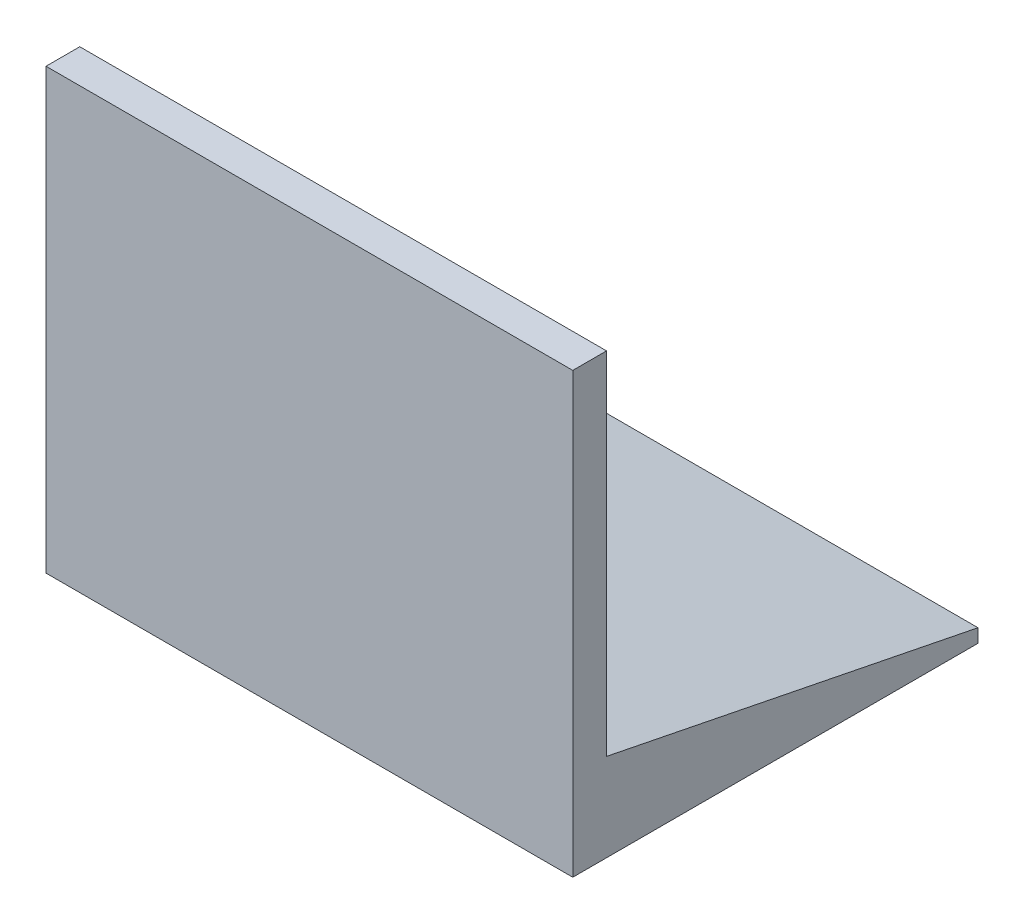
ISO-10303-21;
HEADER;
FILE_DESCRIPTION(('STEP AP214'),'2;1');
FILE_NAME('part.step','',(''),(''),'','','');
FILE_SCHEMA(('AUTOMOTIVE_DESIGN { 1 0 10303 214 1 1 1 1 }'));
ENDSEC;
DATA;
#1=APPLICATION_CONTEXT('core data for automotive mechanical design processes');
#2=APPLICATION_PROTOCOL_DEFINITION('international standard','automotive_design',2000,#1);
#3=PRODUCT_CONTEXT('',#1,'mechanical');
#4=PRODUCT('Part','Part','',(#3));
#5=PRODUCT_RELATED_PRODUCT_CATEGORY('part','',(#4));
#6=PRODUCT_DEFINITION_FORMATION('','',#4);
#7=PRODUCT_DEFINITION_CONTEXT('part definition',#1,'design');
#8=PRODUCT_DEFINITION('design','',#6,#7);
#9=PRODUCT_DEFINITION_SHAPE('','',#8);
#10=(LENGTH_UNIT() NAMED_UNIT(*) SI_UNIT(.MILLI.,.METRE.));
#11=(NAMED_UNIT(*) PLANE_ANGLE_UNIT() SI_UNIT($,.RADIAN.));
#12=(NAMED_UNIT(*) SI_UNIT($,.STERADIAN.) SOLID_ANGLE_UNIT());
#13=UNCERTAINTY_MEASURE_WITH_UNIT(LENGTH_MEASURE(1.E-05),#10,'distance_accuracy_value','');
#14=(GEOMETRIC_REPRESENTATION_CONTEXT(3) GLOBAL_UNCERTAINTY_ASSIGNED_CONTEXT((#13)) GLOBAL_UNIT_ASSIGNED_CONTEXT((#10,
#11,#12)) REPRESENTATION_CONTEXT('',''));
#15=CARTESIAN_POINT('',(0.,0.,0.));
#16=DIRECTION('',(0.,0.,1.));
#17=DIRECTION('',(1.,0.,0.));
#18=AXIS2_PLACEMENT_3D('',#15,#16,#17);
#19=CARTESIAN_POINT('',(390.,325.,0.));
#20=DIRECTION('',(0.,-1.,0.));
#21=DIRECTION('',(0.,0.,-1.));
#22=AXIS2_PLACEMENT_3D('',#19,#20,#21);
#23=PLANE('',#22);
#24=DIRECTION('',(0.,0.,1.));
#25=VECTOR('',#24,1.);
#26=CARTESIAN_POINT('',(0.,325.,0.));
#27=LINE('',#26,#25);
#28=CARTESIAN_POINT('',(0.,325.,-25.));
#29=VERTEX_POINT('',#28);
#30=CARTESIAN_POINT('',(0.,325.,0.));
#31=VERTEX_POINT('',#30);
#32=EDGE_CURVE('E119',#29,#31,#27,.T.);
#33=ORIENTED_EDGE('',*,*,#32,.T.);
#34=DIRECTION('',(-1.,0.,0.));
#35=VECTOR('',#34,1.);
#36=CARTESIAN_POINT('',(390.,325.,0.));
#37=LINE('',#36,#35);
#38=CARTESIAN_POINT('',(390.,325.,0.));
#39=VERTEX_POINT('',#38);
#40=EDGE_CURVE('E11',#39,#31,#37,.T.);
#41=ORIENTED_EDGE('',*,*,#40,.F.);
#42=DIRECTION('',(0.,0.,1.));
#43=VECTOR('',#42,1.);
#44=CARTESIAN_POINT('',(390.,325.,0.));
#45=LINE('',#44,#43);
#46=CARTESIAN_POINT('',(390.,325.,-25.));
#47=VERTEX_POINT('',#46);
#48=EDGE_CURVE('E129',#47,#39,#45,.T.);
#49=ORIENTED_EDGE('',*,*,#48,.F.);
#50=DIRECTION('',(-1.,0.,0.));
#51=VECTOR('',#50,1.);
#52=CARTESIAN_POINT('',(390.,325.,-25.));
#53=LINE('',#52,#51);
#54=EDGE_CURVE('E115',#47,#29,#53,.T.);
#55=ORIENTED_EDGE('',*,*,#54,.T.);
#56=EDGE_LOOP('',(#33,#41,#49,#55));
#57=FACE_BOUND('',#56,.T.);
#58=ADVANCED_FACE('F35',(#57),#23,.F.);
#59=CARTESIAN_POINT('',(390.,0.,0.));
#60=DIRECTION('',(0.,0.,-1.));
#61=DIRECTION('',(-1.,0.,0.));
#62=AXIS2_PLACEMENT_3D('',#59,#60,#61);
#63=PLANE('',#62);
#64=DIRECTION('',(0.,-1.,0.));
#65=VECTOR('',#64,1.);
#66=CARTESIAN_POINT('',(0.,0.,0.));
#67=LINE('',#66,#65);
#68=CARTESIAN_POINT('',(0.,0.,0.));
#69=VERTEX_POINT('',#68);
#70=EDGE_CURVE('E122',#31,#69,#67,.T.);
#71=ORIENTED_EDGE('',*,*,#70,.T.);
#72=DIRECTION('',(-1.,0.,0.));
#73=VECTOR('',#72,1.);
#74=CARTESIAN_POINT('',(390.,0.,0.));
#75=LINE('',#74,#73);
#76=CARTESIAN_POINT('',(390.,0.,0.));
#77=VERTEX_POINT('',#76);
#78=EDGE_CURVE('E43',#77,#69,#75,.T.);
#79=ORIENTED_EDGE('',*,*,#78,.F.);
#80=DIRECTION('',(0.,-1.,0.));
#81=VECTOR('',#80,1.);
#82=CARTESIAN_POINT('',(390.,0.,0.));
#83=LINE('',#82,#81);
#84=EDGE_CURVE('E88',#39,#77,#83,.T.);
#85=ORIENTED_EDGE('',*,*,#84,.F.);
#86=ORIENTED_EDGE('',*,*,#40,.T.);
#87=EDGE_LOOP('',(#71,#79,#85,#86));
#88=FACE_BOUND('',#87,.T.);
#89=ADVANCED_FACE('F153',(#88),#63,.F.);
#90=CARTESIAN_POINT('',(390.,0.,0.));
#91=DIRECTION('',(0.,1.,0.));
#92=DIRECTION('',(0.,0.,1.));
#93=AXIS2_PLACEMENT_3D('',#90,#91,#92);
#94=PLANE('',#93);
#95=DIRECTION('',(0.,0.,-1.));
#96=VECTOR('',#95,1.);
#97=CARTESIAN_POINT('',(0.,0.,0.));
#98=LINE('',#97,#96);
#99=CARTESIAN_POINT('',(0.,0.,-300.));
#100=VERTEX_POINT('',#99);
#101=EDGE_CURVE('E124',#69,#100,#98,.T.);
#102=ORIENTED_EDGE('',*,*,#101,.T.);
#103=DIRECTION('',(-1.,0.,0.));
#104=VECTOR('',#103,1.);
#105=CARTESIAN_POINT('',(390.,0.,-300.));
#106=LINE('',#105,#104);
#107=CARTESIAN_POINT('',(390.,0.,-300.));
#108=VERTEX_POINT('',#107);
#109=EDGE_CURVE('E110',#108,#100,#106,.T.);
#110=ORIENTED_EDGE('',*,*,#109,.F.);
#111=DIRECTION('',(0.,0.,-1.));
#112=VECTOR('',#111,1.);
#113=CARTESIAN_POINT('',(390.,0.,0.));
#114=LINE('',#113,#112);
#115=EDGE_CURVE('E101',#77,#108,#114,.T.);
#116=ORIENTED_EDGE('',*,*,#115,.F.);
#117=ORIENTED_EDGE('',*,*,#78,.T.);
#118=EDGE_LOOP('',(#102,#110,#116,#117));
#119=FACE_BOUND('',#118,.T.);
#120=ADVANCED_FACE('F135',(#119),#94,.F.);
#121=CARTESIAN_POINT('',(390.,0.,-300.));
#122=DIRECTION('',(0.,0.,1.));
#123=DIRECTION('',(1.,0.,0.));
#124=AXIS2_PLACEMENT_3D('',#121,#122,#123);
#125=PLANE('',#124);
#126=DIRECTION('',(0.,1.,0.));
#127=VECTOR('',#126,1.);
#128=CARTESIAN_POINT('',(0.,0.,-300.));
#129=LINE('',#128,#127);
#130=CARTESIAN_POINT('',(0.,10.,-300.));
#131=VERTEX_POINT('',#130);
#132=EDGE_CURVE('E109',#100,#131,#129,.T.);
#133=ORIENTED_EDGE('',*,*,#132,.T.);
#134=DIRECTION('',(-1.,0.,0.));
#135=VECTOR('',#134,1.);
#136=CARTESIAN_POINT('',(390.,10.,-300.));
#137=LINE('',#136,#135);
#138=CARTESIAN_POINT('',(390.,10.,-300.));
#139=VERTEX_POINT('',#138);
#140=EDGE_CURVE('E106',#139,#131,#137,.T.);
#141=ORIENTED_EDGE('',*,*,#140,.F.);
#142=DIRECTION('',(0.,1.,0.));
#143=VECTOR('',#142,1.);
#144=CARTESIAN_POINT('',(390.,0.,-300.));
#145=LINE('',#144,#143);
#146=EDGE_CURVE('E95',#108,#139,#145,.T.);
#147=ORIENTED_EDGE('',*,*,#146,.F.);
#148=ORIENTED_EDGE('',*,*,#109,.T.);
#149=EDGE_LOOP('',(#133,#141,#147,#148));
#150=FACE_BOUND('',#149,.T.);
#151=ADVANCED_FACE('F107',(#150),#125,.F.);
#152=CARTESIAN_POINT('',(390.,67.3076923076923,-13.4615384615385));
#153=DIRECTION('',(0.,-0.98058067569092,0.196116135138184));
#154=DIRECTION('',(0.,-0.196116135138184,-0.98058067569092));
#155=AXIS2_PLACEMENT_3D('',#152,#153,#154);
#156=PLANE('',#155);
#157=DIRECTION('',(0.,0.196116135138184,0.98058067569092));
#158=VECTOR('',#157,1.);
#159=CARTESIAN_POINT('',(0.,67.3076923076923,-13.4615384615385));
#160=LINE('',#159,#158);
#161=CARTESIAN_POINT('',(0.,65.,-25.));
#162=VERTEX_POINT('',#161);
#163=EDGE_CURVE('E74',#131,#162,#160,.T.);
#164=ORIENTED_EDGE('',*,*,#163,.T.);
#165=DIRECTION('',(-1.,0.,0.));
#166=VECTOR('',#165,1.);
#167=CARTESIAN_POINT('',(390.,65.,-25.));
#168=LINE('',#167,#166);
#169=CARTESIAN_POINT('',(390.,65.,-25.));
#170=VERTEX_POINT('',#169);
#171=EDGE_CURVE('E111',#170,#162,#168,.T.);
#172=ORIENTED_EDGE('',*,*,#171,.F.);
#173=DIRECTION('',(0.,0.196116135138184,0.98058067569092));
#174=VECTOR('',#173,1.);
#175=CARTESIAN_POINT('',(390.,67.3076923076923,-13.4615384615385));
#176=LINE('',#175,#174);
#177=EDGE_CURVE('E99',#139,#170,#176,.T.);
#178=ORIENTED_EDGE('',*,*,#177,.F.);
#179=ORIENTED_EDGE('',*,*,#140,.T.);
#180=EDGE_LOOP('',(#164,#172,#178,#179));
#181=FACE_BOUND('',#180,.T.);
#182=ADVANCED_FACE('F113',(#181),#156,.F.);
#183=CARTESIAN_POINT('',(390.,0.,-25.));
#184=DIRECTION('',(0.,0.,1.));
#185=DIRECTION('',(1.,0.,0.));
#186=AXIS2_PLACEMENT_3D('',#183,#184,#185);
#187=PLANE('',#186);
#188=DIRECTION('',(0.,1.,0.));
#189=VECTOR('',#188,1.);
#190=CARTESIAN_POINT('',(0.,0.,-25.));
#191=LINE('',#190,#189);
#192=EDGE_CURVE('E80',#162,#29,#191,.T.);
#193=ORIENTED_EDGE('',*,*,#192,.T.);
#194=ORIENTED_EDGE('',*,*,#54,.F.);
#195=DIRECTION('',(0.,1.,0.));
#196=VECTOR('',#195,1.);
#197=CARTESIAN_POINT('',(390.,0.,-25.));
#198=LINE('',#197,#196);
#199=EDGE_CURVE('E51',#170,#47,#198,.T.);
#200=ORIENTED_EDGE('',*,*,#199,.F.);
#201=ORIENTED_EDGE('',*,*,#171,.T.);
#202=EDGE_LOOP('',(#193,#194,#200,#201));
#203=FACE_BOUND('',#202,.T.);
#204=ADVANCED_FACE('F142',(#203),#187,.F.);
#205=CARTESIAN_POINT('',(390.,0.,0.));
#206=DIRECTION('',(1.,0.,0.));
#207=DIRECTION('',(0.,0.,-1.));
#208=AXIS2_PLACEMENT_3D('',#205,#206,#207);
#209=PLANE('',#208);
#210=ORIENTED_EDGE('',*,*,#48,.T.);
#211=ORIENTED_EDGE('',*,*,#84,.T.);
#212=ORIENTED_EDGE('',*,*,#115,.T.);
#213=ORIENTED_EDGE('',*,*,#146,.T.);
#214=ORIENTED_EDGE('',*,*,#177,.T.);
#215=ORIENTED_EDGE('',*,*,#199,.T.);
#216=EDGE_LOOP('',(#210,#211,#212,#213,#214,#215));
#217=FACE_BOUND('',#216,.T.);
#218=ADVANCED_FACE('F97',(#217),#209,.T.);
#219=CARTESIAN_POINT('',(0.,0.,0.));
#220=DIRECTION('',(1.,0.,0.));
#221=DIRECTION('',(0.,0.,-1.));
#222=AXIS2_PLACEMENT_3D('',#219,#220,#221);
#223=PLANE('',#222);
#224=ORIENTED_EDGE('',*,*,#32,.F.);
#225=ORIENTED_EDGE('',*,*,#192,.F.);
#226=ORIENTED_EDGE('',*,*,#163,.F.);
#227=ORIENTED_EDGE('',*,*,#132,.F.);
#228=ORIENTED_EDGE('',*,*,#101,.F.);
#229=ORIENTED_EDGE('',*,*,#70,.F.);
#230=EDGE_LOOP('',(#224,#225,#226,#227,#228,#229));
#231=FACE_BOUND('',#230,.T.);
#232=ADVANCED_FACE('F138',(#231),#223,.F.);
#233=CLOSED_SHELL('',(#58,#89,#120,#151,#182,#204,#218,#232));
#234=MANIFOLD_SOLID_BREP('B2',#233);
#235=ADVANCED_BREP_SHAPE_REPRESENTATION('',(#18,#234),#14);
#236=SHAPE_DEFINITION_REPRESENTATION(#9,#235);
ENDSEC;
END-ISO-10303-21;
